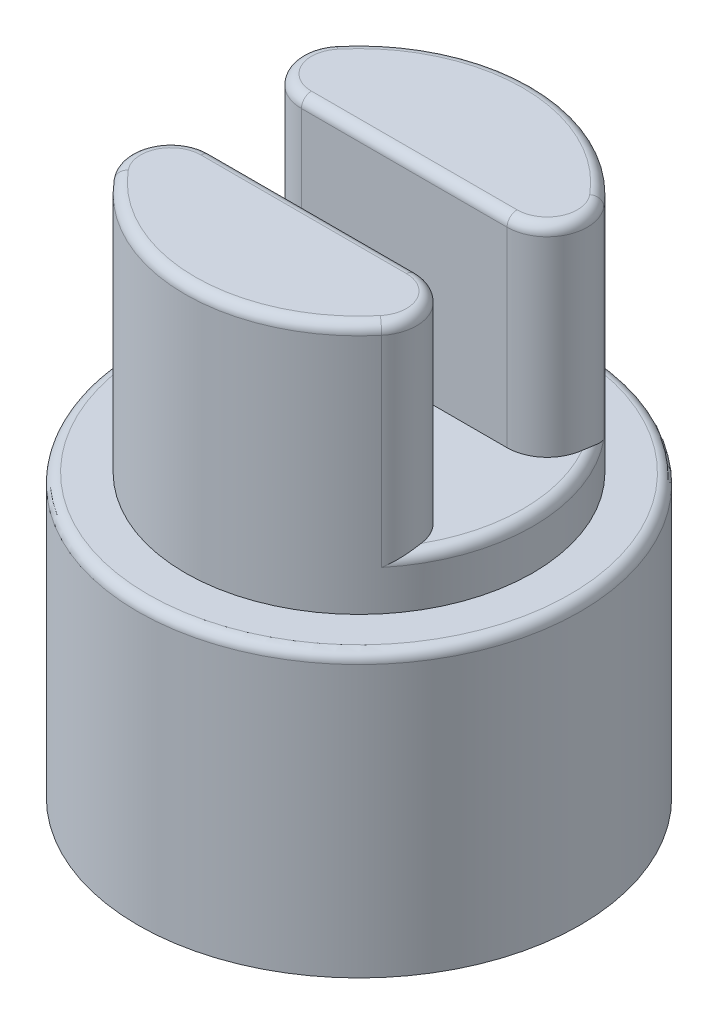
ISO-10303-21;
HEADER;
FILE_DESCRIPTION(('STEP AP214'),'2;1');
FILE_NAME('part.step','',(''),(''),'','','');
FILE_SCHEMA(('AUTOMOTIVE_DESIGN { 1 0 10303 214 1 1 1 1 }'));
ENDSEC;
DATA;
#1=APPLICATION_CONTEXT('core data for automotive mechanical design processes');
#2=APPLICATION_PROTOCOL_DEFINITION('international standard','automotive_design',2000,#1);
#3=PRODUCT_CONTEXT('',#1,'mechanical');
#4=PRODUCT('Part','Part','',(#3));
#5=PRODUCT_RELATED_PRODUCT_CATEGORY('part','',(#4));
#6=PRODUCT_DEFINITION_FORMATION('','',#4);
#7=PRODUCT_DEFINITION_CONTEXT('part definition',#1,'design');
#8=PRODUCT_DEFINITION('design','',#6,#7);
#9=PRODUCT_DEFINITION_SHAPE('','',#8);
#10=(LENGTH_UNIT() NAMED_UNIT(*) SI_UNIT(.MILLI.,.METRE.));
#11=(NAMED_UNIT(*) PLANE_ANGLE_UNIT() SI_UNIT($,.RADIAN.));
#12=(NAMED_UNIT(*) SI_UNIT($,.STERADIAN.) SOLID_ANGLE_UNIT());
#13=UNCERTAINTY_MEASURE_WITH_UNIT(LENGTH_MEASURE(1.E-05),#10,'distance_accuracy_value','');
#14=(GEOMETRIC_REPRESENTATION_CONTEXT(3) GLOBAL_UNCERTAINTY_ASSIGNED_CONTEXT((#13)) GLOBAL_UNIT_ASSIGNED_CONTEXT((#10,
#11,#12)) REPRESENTATION_CONTEXT('',''));
#15=CARTESIAN_POINT('',(0.,0.,0.));
#16=DIRECTION('',(0.,0.,1.));
#17=DIRECTION('',(1.,0.,0.));
#18=AXIS2_PLACEMENT_3D('',#15,#16,#17);
#19=CARTESIAN_POINT('',(0.,20.955,0.));
#20=DIRECTION('',(0.,1.,0.));
#21=DIRECTION('',(0.,0.,1.));
#22=AXIS2_PLACEMENT_3D('',#19,#20,#21);
#23=PLANE('',#22);
#24=CARTESIAN_POINT('',(6.49564962109256,20.955,5.3975));
#25=DIRECTION('',(0.,1.,0.));
#26=DIRECTION('',(0.,0.,1.));
#27=AXIS2_PLACEMENT_3D('',#24,#25,#26);
#28=CIRCLE('',#27,2.54);
#29=CARTESIAN_POINT('',(6.49564962109256,20.955,2.8575));
#30=VERTEX_POINT('',#29);
#31=CARTESIAN_POINT('',(9.01616246549347,20.955,5.08346974475373));
#32=VERTEX_POINT('',#31);
#33=EDGE_CURVE('E359',#30,#32,#28,.F.);
#34=ORIENTED_EDGE('',*,*,#33,.T.);
#35=CARTESIAN_POINT('',(0.,20.955,0.));
#36=DIRECTION('',(0.,1.,0.));
#37=DIRECTION('',(0.,0.,1.));
#38=AXIS2_PLACEMENT_3D('',#35,#36,#37);
#39=CIRCLE('',#38,10.3505);
#40=CARTESIAN_POINT('',(9.01616246549347,20.955,-5.08346974475373));
#41=VERTEX_POINT('',#40);
#42=EDGE_CURVE('E433',#32,#41,#39,.T.);
#43=ORIENTED_EDGE('',*,*,#42,.T.);
#44=CARTESIAN_POINT('',(6.49564962109257,20.955,-5.3975));
#45=DIRECTION('',(0.,1.,0.));
#46=DIRECTION('',(0.,0.,1.));
#47=AXIS2_PLACEMENT_3D('',#44,#45,#46);
#48=CIRCLE('',#47,2.54);
#49=CARTESIAN_POINT('',(6.49564962109256,20.955,-2.8575));
#50=VERTEX_POINT('',#49);
#51=EDGE_CURVE('E362',#41,#50,#48,.F.);
#52=ORIENTED_EDGE('',*,*,#51,.T.);
#53=DIRECTION('',(1.,0.,0.));
#54=VECTOR('',#53,1.);
#55=CARTESIAN_POINT('',(-10.6073514130531,20.955,-2.8575));
#56=LINE('',#55,#54);
#57=CARTESIAN_POINT('',(-6.49564962109257,20.955,-2.8575));
#58=VERTEX_POINT('',#57);
#59=EDGE_CURVE('E308',#58,#50,#56,.T.);
#60=ORIENTED_EDGE('',*,*,#59,.F.);
#61=CARTESIAN_POINT('',(-6.49564962109257,20.955,-5.3975));
#62=DIRECTION('',(0.,1.,0.));
#63=DIRECTION('',(0.,0.,1.));
#64=AXIS2_PLACEMENT_3D('',#61,#62,#63);
#65=CIRCLE('',#64,2.54);
#66=CARTESIAN_POINT('',(-9.01616246549347,20.955,-5.08346974475373));
#67=VERTEX_POINT('',#66);
#68=EDGE_CURVE('E355',#58,#67,#65,.F.);
#69=ORIENTED_EDGE('',*,*,#68,.T.);
#70=CARTESIAN_POINT('',(0.,20.955,0.));
#71=DIRECTION('',(0.,1.,0.));
#72=DIRECTION('',(0.,0.,1.));
#73=AXIS2_PLACEMENT_3D('',#70,#71,#72);
#74=CIRCLE('',#73,10.3505);
#75=CARTESIAN_POINT('',(-9.01616246549347,20.955,5.08346974475373));
#76=VERTEX_POINT('',#75);
#77=EDGE_CURVE('E429',#67,#76,#74,.T.);
#78=ORIENTED_EDGE('',*,*,#77,.T.);
#79=CARTESIAN_POINT('',(-6.49564962109256,20.955,5.3975));
#80=DIRECTION('',(0.,1.,0.));
#81=DIRECTION('',(0.,0.,1.));
#82=AXIS2_PLACEMENT_3D('',#79,#80,#81);
#83=CIRCLE('',#82,2.54);
#84=CARTESIAN_POINT('',(-6.49564962109257,20.955,2.8575));
#85=VERTEX_POINT('',#84);
#86=EDGE_CURVE('E352',#76,#85,#83,.F.);
#87=ORIENTED_EDGE('',*,*,#86,.T.);
#88=DIRECTION('',(-1.,0.,0.));
#89=VECTOR('',#88,1.);
#90=CARTESIAN_POINT('',(-10.6073514130531,20.955,2.8575));
#91=LINE('',#90,#89);
#92=EDGE_CURVE('E312',#30,#85,#91,.T.);
#93=ORIENTED_EDGE('',*,*,#92,.F.);
#94=EDGE_LOOP('',(#34,#43,#52,#60,#69,#78,#87,#93));
#95=FACE_BOUND('',#94,.T.);
#96=ADVANCED_FACE('F43',(#95),#23,.T.);
#97=CARTESIAN_POINT('',(0.,17.78,0.));
#98=DIRECTION('',(0.,-1.,0.));
#99=DIRECTION('',(0.,0.,-1.));
#100=AXIS2_PLACEMENT_3D('',#97,#98,#99);
#101=CYLINDRICAL_SURFACE('',#100,13.97);
#102=CARTESIAN_POINT('',(0.,17.145,0.));
#103=DIRECTION('',(0.,1.,0.));
#104=DIRECTION('',(0.,0.,1.));
#105=AXIS2_PLACEMENT_3D('',#102,#103,#104);
#106=CIRCLE('',#105,13.97);
#107=CARTESIAN_POINT('',(0.,17.145,13.97));
#108=VERTEX_POINT('',#107);
#109=EDGE_CURVE('E425',#108,#108,#106,.F.);
#110=ORIENTED_EDGE('',*,*,#109,.T.);
#111=EDGE_LOOP('',(#110));
#112=FACE_BOUND('',#111,.T.);
#113=CARTESIAN_POINT('',(0.,0.,0.));
#114=DIRECTION('',(0.,1.,0.));
#115=DIRECTION('',(0.,0.,1.));
#116=AXIS2_PLACEMENT_3D('',#113,#114,#115);
#117=CIRCLE('',#116,13.97);
#118=CARTESIAN_POINT('',(0.,0.,13.97));
#119=VERTEX_POINT('',#118);
#120=EDGE_CURVE('E317',#119,#119,#117,.T.);
#121=ORIENTED_EDGE('',*,*,#120,.T.);
#122=EDGE_LOOP('',(#121));
#123=FACE_BOUND('',#122,.T.);
#124=ADVANCED_FACE('F507',(#112,#123),#101,.T.);
#125=CARTESIAN_POINT('',(0.,17.78,0.));
#126=DIRECTION('',(0.,1.,0.));
#127=DIRECTION('',(0.,0.,1.));
#128=AXIS2_PLACEMENT_3D('',#125,#126,#127);
#129=PLANE('',#128);
#130=CARTESIAN_POINT('',(0.,17.78,0.));
#131=DIRECTION('',(0.,1.,0.));
#132=DIRECTION('',(0.,0.,1.));
#133=AXIS2_PLACEMENT_3D('',#130,#131,#132);
#134=CIRCLE('',#133,13.335);
#135=CARTESIAN_POINT('',(0.,17.78,13.335));
#136=VERTEX_POINT('',#135);
#137=EDGE_CURVE('E421',#136,#136,#134,.T.);
#138=ORIENTED_EDGE('',*,*,#137,.T.);
#139=EDGE_LOOP('',(#138));
#140=FACE_BOUND('',#139,.T.);
#141=CARTESIAN_POINT('',(0.,17.78,0.));
#142=DIRECTION('',(0.,1.,0.));
#143=DIRECTION('',(0.,0.,1.));
#144=AXIS2_PLACEMENT_3D('',#141,#142,#143);
#145=CIRCLE('',#144,10.9855);
#146=CARTESIAN_POINT('',(0.,17.78,10.9855));
#147=VERTEX_POINT('',#146);
#148=EDGE_CURVE('E318',#147,#147,#145,.T.);
#149=ORIENTED_EDGE('',*,*,#148,.F.);
#150=EDGE_LOOP('',(#149));
#151=FACE_BOUND('',#150,.T.);
#152=ADVANCED_FACE('F513',(#140,#151),#129,.T.);
#153=CARTESIAN_POINT('',(0.,0.,0.));
#154=DIRECTION('',(0.,1.,0.));
#155=DIRECTION('',(0.,0.,1.));
#156=AXIS2_PLACEMENT_3D('',#153,#154,#155);
#157=PLANE('',#156);
#158=CARTESIAN_POINT('',(0.,0.,0.));
#159=DIRECTION('',(0.,1.,0.));
#160=DIRECTION('',(0.,0.,1.));
#161=AXIS2_PLACEMENT_3D('',#158,#159,#160);
#162=CIRCLE('',#161,12.7);
#163=CARTESIAN_POINT('',(0.,0.,12.7));
#164=VERTEX_POINT('',#163);
#165=EDGE_CURVE('E256',#164,#164,#162,.T.);
#166=ORIENTED_EDGE('',*,*,#165,.T.);
#167=EDGE_LOOP('',(#166));
#168=FACE_BOUND('',#167,.T.);
#169=ORIENTED_EDGE('',*,*,#120,.F.);
#170=EDGE_LOOP('',(#169));
#171=FACE_BOUND('',#170,.T.);
#172=ADVANCED_FACE('F523',(#168,#171),#157,.F.);
#173=CARTESIAN_POINT('',(0.,20.955,0.));
#174=DIRECTION('',(0.,-1.,0.));
#175=DIRECTION('',(0.,0.,-1.));
#176=AXIS2_PLACEMENT_3D('',#173,#174,#175);
#177=CYLINDRICAL_SURFACE('',#176,10.9855);
#178=DIRECTION('',(0.,-1.,0.));
#179=VECTOR('',#178,1.);
#180=CARTESIAN_POINT('',(-8.44922845450387,20.955,-7.02080827067669));
#181=LINE('',#180,#179);
#182=CARTESIAN_POINT('',(-8.44922845450387,20.32,-7.02080827067669));
#183=VERTEX_POINT('',#182);
#184=CARTESIAN_POINT('',(-8.44922845450387,33.02,-7.02080827067669));
#185=VERTEX_POINT('',#184);
#186=EDGE_CURVE('E332',#183,#185,#181,.F.);
#187=ORIENTED_EDGE('',*,*,#186,.T.);
#188=CARTESIAN_POINT('',(0.,33.02,0.));
#189=DIRECTION('',(0.,-1.,0.));
#190=DIRECTION('',(0.,0.,-1.));
#191=AXIS2_PLACEMENT_3D('',#188,#189,#190);
#192=CIRCLE('',#191,10.9855);
#193=CARTESIAN_POINT('',(8.44922845450387,33.02,-7.02080827067669));
#194=VERTEX_POINT('',#193);
#195=EDGE_CURVE('E393',#185,#194,#192,.T.);
#196=ORIENTED_EDGE('',*,*,#195,.T.);
#197=DIRECTION('',(0.,-1.,0.));
#198=VECTOR('',#197,1.);
#199=CARTESIAN_POINT('',(8.44922845450387,20.955,-7.02080827067669));
#200=LINE('',#199,#198);
#201=CARTESIAN_POINT('',(8.44922845450387,20.32,-7.02080827067669));
#202=VERTEX_POINT('',#201);
#203=EDGE_CURVE('E322',#194,#202,#200,.T.);
#204=ORIENTED_EDGE('',*,*,#203,.T.);
#205=CARTESIAN_POINT('',(0.,20.32,0.));
#206=DIRECTION('',(0.,1.,0.));
#207=DIRECTION('',(0.,0.,1.));
#208=AXIS2_PLACEMENT_3D('',#205,#206,#207);
#209=CIRCLE('',#208,10.9855);
#210=CARTESIAN_POINT('',(8.44922845450386,20.32,7.02080827067669));
#211=VERTEX_POINT('',#210);
#212=EDGE_CURVE('E389',#202,#211,#209,.F.);
#213=ORIENTED_EDGE('',*,*,#212,.T.);
#214=DIRECTION('',(0.,-1.,0.));
#215=VECTOR('',#214,1.);
#216=CARTESIAN_POINT('',(8.44922845450386,20.955,7.02080827067669));
#217=LINE('',#216,#215);
#218=CARTESIAN_POINT('',(8.44922845450386,33.02,7.02080827067669));
#219=VERTEX_POINT('',#218);
#220=EDGE_CURVE('E328',#211,#219,#217,.F.);
#221=ORIENTED_EDGE('',*,*,#220,.T.);
#222=CARTESIAN_POINT('',(0.,33.02,0.));
#223=DIRECTION('',(0.,1.,0.));
#224=DIRECTION('',(0.,0.,1.));
#225=AXIS2_PLACEMENT_3D('',#222,#223,#224);
#226=CIRCLE('',#225,10.9855);
#227=CARTESIAN_POINT('',(-8.44922845450386,33.02,7.02080827067669));
#228=VERTEX_POINT('',#227);
#229=EDGE_CURVE('E382',#219,#228,#226,.F.);
#230=ORIENTED_EDGE('',*,*,#229,.T.);
#231=DIRECTION('',(0.,-1.,0.));
#232=VECTOR('',#231,1.);
#233=CARTESIAN_POINT('',(-8.44922845450386,20.955,7.02080827067669));
#234=LINE('',#233,#232);
#235=CARTESIAN_POINT('',(-8.44922845450386,20.32,7.02080827067669));
#236=VERTEX_POINT('',#235);
#237=EDGE_CURVE('E336',#228,#236,#234,.T.);
#238=ORIENTED_EDGE('',*,*,#237,.T.);
#239=CARTESIAN_POINT('',(0.,20.32,0.));
#240=DIRECTION('',(0.,1.,0.));
#241=DIRECTION('',(0.,0.,1.));
#242=AXIS2_PLACEMENT_3D('',#239,#240,#241);
#243=CIRCLE('',#242,10.9855);
#244=EDGE_CURVE('E385',#236,#183,#243,.F.);
#245=ORIENTED_EDGE('',*,*,#244,.T.);
#246=EDGE_LOOP('',(#187,#196,#204,#213,#221,#230,#238,#245));
#247=FACE_BOUND('',#246,.T.);
#248=ORIENTED_EDGE('',*,*,#148,.T.);
#249=EDGE_LOOP('',(#248));
#250=FACE_BOUND('',#249,.T.);
#251=ADVANCED_FACE('F520',(#247,#250),#177,.T.);
#252=CARTESIAN_POINT('',(-10.6073514130531,33.655,2.8575));
#253=DIRECTION('',(0.,0.,1.));
#254=DIRECTION('',(1.,0.,0.));
#255=AXIS2_PLACEMENT_3D('',#252,#253,#254);
#256=PLANE('',#255);
#257=DIRECTION('',(0.,-1.,0.));
#258=VECTOR('',#257,1.);
#259=CARTESIAN_POINT('',(-6.49564962109256,33.655,2.8575));
#260=LINE('',#259,#258);
#261=CARTESIAN_POINT('',(-6.49564962109256,33.02,2.8575));
#262=VERTEX_POINT('',#261);
#263=EDGE_CURVE('E342',#85,#262,#260,.F.);
#264=ORIENTED_EDGE('',*,*,#263,.T.);
#265=DIRECTION('',(-1.,0.,0.));
#266=VECTOR('',#265,1.);
#267=CARTESIAN_POINT('',(6.49564962109256,33.02,2.8575));
#268=LINE('',#267,#266);
#269=CARTESIAN_POINT('',(6.49564962109256,33.02,2.8575));
#270=VERTEX_POINT('',#269);
#271=EDGE_CURVE('E70',#262,#270,#268,.F.);
#272=ORIENTED_EDGE('',*,*,#271,.T.);
#273=DIRECTION('',(0.,-1.,0.));
#274=VECTOR('',#273,1.);
#275=CARTESIAN_POINT('',(6.49564962109256,33.655,2.8575));
#276=LINE('',#275,#274);
#277=EDGE_CURVE('E339',#270,#30,#276,.T.);
#278=ORIENTED_EDGE('',*,*,#277,.T.);
#279=ORIENTED_EDGE('',*,*,#92,.T.);
#280=EDGE_LOOP('',(#264,#272,#278,#279));
#281=FACE_BOUND('',#280,.T.);
#282=ADVANCED_FACE('F518',(#281),#256,.F.);
#283=CARTESIAN_POINT('',(0.,33.655,0.));
#284=DIRECTION('',(0.,1.,0.));
#285=DIRECTION('',(0.,0.,1.));
#286=AXIS2_PLACEMENT_3D('',#283,#284,#285);
#287=PLANE('',#286);
#288=DIRECTION('',(-1.,0.,0.));
#289=VECTOR('',#288,1.);
#290=CARTESIAN_POINT('',(-6.49564962109257,33.655,3.4925));
#291=LINE('',#290,#289);
#292=CARTESIAN_POINT('',(6.49564962109256,33.655,3.4925));
#293=VERTEX_POINT('',#292);
#294=CARTESIAN_POINT('',(-6.49564962109256,33.655,3.4925));
#295=VERTEX_POINT('',#294);
#296=EDGE_CURVE('E405',#293,#295,#291,.T.);
#297=ORIENTED_EDGE('',*,*,#296,.T.);
#298=CARTESIAN_POINT('',(-6.49564962109256,33.655,5.3975));
#299=DIRECTION('',(0.,1.,0.));
#300=DIRECTION('',(0.,0.,1.));
#301=AXIS2_PLACEMENT_3D('',#298,#299,#300);
#302=CIRCLE('',#301,1.905);
#303=CARTESIAN_POINT('',(-7.96083374615104,33.655,6.61498120300752));
#304=VERTEX_POINT('',#303);
#305=EDGE_CURVE('E408',#295,#304,#302,.T.);
#306=ORIENTED_EDGE('',*,*,#305,.T.);
#307=CARTESIAN_POINT('',(0.,33.655,0.));
#308=DIRECTION('',(0.,1.,0.));
#309=DIRECTION('',(0.,0.,1.));
#310=AXIS2_PLACEMENT_3D('',#307,#308,#309);
#311=CIRCLE('',#310,10.3505);
#312=CARTESIAN_POINT('',(7.96083374615104,33.655,6.61498120300752));
#313=VERTEX_POINT('',#312);
#314=EDGE_CURVE('E399',#304,#313,#311,.T.);
#315=ORIENTED_EDGE('',*,*,#314,.T.);
#316=CARTESIAN_POINT('',(6.49564962109256,33.655,5.3975));
#317=DIRECTION('',(0.,1.,0.));
#318=DIRECTION('',(0.,0.,1.));
#319=AXIS2_PLACEMENT_3D('',#316,#317,#318);
#320=CIRCLE('',#319,1.905);
#321=EDGE_CURVE('E402',#313,#293,#320,.T.);
#322=ORIENTED_EDGE('',*,*,#321,.T.);
#323=EDGE_LOOP('',(#297,#306,#315,#322));
#324=FACE_BOUND('',#323,.T.);
#325=ADVANCED_FACE('F613',(#324),#287,.T.);
#326=CARTESIAN_POINT('',(-10.6073514130531,33.655,-2.8575));
#327=DIRECTION('',(0.,0.,-1.));
#328=DIRECTION('',(-1.,0.,0.));
#329=AXIS2_PLACEMENT_3D('',#326,#327,#328);
#330=PLANE('',#329);
#331=DIRECTION('',(0.,-1.,0.));
#332=VECTOR('',#331,1.);
#333=CARTESIAN_POINT('',(6.49564962109257,33.655,-2.8575));
#334=LINE('',#333,#332);
#335=CARTESIAN_POINT('',(6.49564962109257,33.02,-2.8575));
#336=VERTEX_POINT('',#335);
#337=EDGE_CURVE('E345',#50,#336,#334,.F.);
#338=ORIENTED_EDGE('',*,*,#337,.T.);
#339=DIRECTION('',(1.,0.,0.));
#340=VECTOR('',#339,1.);
#341=CARTESIAN_POINT('',(-10.6073514130531,33.02,-2.8575));
#342=LINE('',#341,#340);
#343=CARTESIAN_POINT('',(-6.49564962109257,33.02,-2.8575));
#344=VERTEX_POINT('',#343);
#345=EDGE_CURVE('E437',#336,#344,#342,.F.);
#346=ORIENTED_EDGE('',*,*,#345,.T.);
#347=DIRECTION('',(0.,-1.,0.));
#348=VECTOR('',#347,1.);
#349=CARTESIAN_POINT('',(-6.49564962109257,33.655,-2.8575));
#350=LINE('',#349,#348);
#351=EDGE_CURVE('E349',#344,#58,#350,.T.);
#352=ORIENTED_EDGE('',*,*,#351,.T.);
#353=ORIENTED_EDGE('',*,*,#59,.T.);
#354=EDGE_LOOP('',(#338,#346,#352,#353));
#355=FACE_BOUND('',#354,.T.);
#356=ADVANCED_FACE('F592',(#355),#330,.F.);
#357=CARTESIAN_POINT('',(0.,33.655,0.));
#358=DIRECTION('',(0.,-1.,0.));
#359=DIRECTION('',(0.,0.,-1.));
#360=AXIS2_PLACEMENT_3D('',#357,#358,#359);
#361=PLANE('',#360);
#362=CARTESIAN_POINT('',(0.,33.655,0.));
#363=DIRECTION('',(0.,-1.,0.));
#364=DIRECTION('',(0.,0.,-1.));
#365=AXIS2_PLACEMENT_3D('',#362,#363,#364);
#366=CIRCLE('',#365,10.3505);
#367=CARTESIAN_POINT('',(7.96083374615104,33.655,-6.61498120300752));
#368=VERTEX_POINT('',#367);
#369=CARTESIAN_POINT('',(-7.96083374615104,33.655,-6.61498120300752));
#370=VERTEX_POINT('',#369);
#371=EDGE_CURVE('E371',#368,#370,#366,.F.);
#372=ORIENTED_EDGE('',*,*,#371,.T.);
#373=CARTESIAN_POINT('',(-6.49564962109257,33.655,-5.3975));
#374=DIRECTION('',(0.,-1.,0.));
#375=DIRECTION('',(0.,0.,-1.));
#376=AXIS2_PLACEMENT_3D('',#373,#374,#375);
#377=CIRCLE('',#376,1.905);
#378=CARTESIAN_POINT('',(-6.49564962109257,33.655,-3.4925));
#379=VERTEX_POINT('',#378);
#380=EDGE_CURVE('E374',#370,#379,#377,.F.);
#381=ORIENTED_EDGE('',*,*,#380,.T.);
#382=DIRECTION('',(1.,0.,0.));
#383=VECTOR('',#382,1.);
#384=CARTESIAN_POINT('',(0.,33.655,-3.4925));
#385=LINE('',#384,#383);
#386=CARTESIAN_POINT('',(6.49564962109257,33.655,-3.4925));
#387=VERTEX_POINT('',#386);
#388=EDGE_CURVE('E365',#379,#387,#385,.T.);
#389=ORIENTED_EDGE('',*,*,#388,.T.);
#390=CARTESIAN_POINT('',(6.49564962109257,33.655,-5.3975));
#391=DIRECTION('',(0.,-1.,0.));
#392=DIRECTION('',(0.,0.,-1.));
#393=AXIS2_PLACEMENT_3D('',#390,#391,#392);
#394=CIRCLE('',#393,1.905);
#395=EDGE_CURVE('E368',#387,#368,#394,.F.);
#396=ORIENTED_EDGE('',*,*,#395,.T.);
#397=EDGE_LOOP('',(#372,#381,#389,#396));
#398=FACE_BOUND('',#397,.T.);
#399=ADVANCED_FACE('F535',(#398),#361,.F.);
#400=CARTESIAN_POINT('',(-6.49564962109256,20.955,5.3975));
#401=DIRECTION('',(0.,-1.,0.));
#402=DIRECTION('',(0.,0.,-1.));
#403=AXIS2_PLACEMENT_3D('',#400,#401,#402);
#404=CYLINDRICAL_SURFACE('',#403,2.54);
#405=ORIENTED_EDGE('',*,*,#237,.F.);
#406=CARTESIAN_POINT('',(-6.49564962109256,33.02,5.3975));
#407=DIRECTION('',(0.,1.,0.));
#408=DIRECTION('',(0.,0.,1.));
#409=AXIS2_PLACEMENT_3D('',#406,#407,#408);
#410=CIRCLE('',#409,2.54);
#411=EDGE_CURVE('E412',#228,#262,#410,.F.);
#412=ORIENTED_EDGE('',*,*,#411,.T.);
#413=ORIENTED_EDGE('',*,*,#263,.F.);
#414=ORIENTED_EDGE('',*,*,#86,.F.);
#415=CARTESIAN_POINT('',(-9.01616246549347,20.955,5.08346974475373));
#416=CARTESIAN_POINT('',(-9.0219481865761,20.9549815472587,5.12985411561563));
#417=CARTESIAN_POINT('',(-9.02643539373392,20.9531737831505,5.17635826215241));
#418=CARTESIAN_POINT('',(-9.03283457831511,20.9465031135339,5.26925267447678));
#419=CARTESIAN_POINT('',(-9.03475080844922,20.9416452728182,5.31564300131407));
#420=CARTESIAN_POINT('',(-9.03604452649734,20.9294349106086,5.40780630217329));
#421=CARTESIAN_POINT('',(-9.03543870635608,20.9220990856887,5.45358132999755));
#422=CARTESIAN_POINT('',(-9.03179333420189,20.9053122602238,5.54465801106835));
#423=CARTESIAN_POINT('',(-9.02875234831828,20.8958600158547,5.58995936948415));
#424=CARTESIAN_POINT('',(-9.01221570216551,20.8554188430998,5.76601096889285));
#425=CARTESIAN_POINT('',(-8.98984795443309,20.8178090501096,5.89451554627302));
#426=CARTESIAN_POINT('',(-8.92685911469528,20.7334385772713,6.14417192374147));
#427=CARTESIAN_POINT('',(-8.88615599221247,20.6866373124162,6.26528787220472));
#428=CARTESIAN_POINT('',(-8.78880893916351,20.5883754161008,6.49686190492321));
#429=CARTESIAN_POINT('',(-8.7323630979387,20.5369777572737,6.60743087236158));
#430=CARTESIAN_POINT('',(-8.60480325184468,20.4319091828923,6.81812786411293));
#431=CARTESIAN_POINT('',(-8.53373163103459,20.3782451843679,6.91828482640447));
#432=CARTESIAN_POINT('',(-8.45370865906112,20.3230771227777,7.01540516693211));
#433=CARTESIAN_POINT('',(-8.45147131439272,20.3215385325327,7.01810909160627));
#434=CARTESIAN_POINT('',(-8.44922845450386,20.32,7.02080827067669));
#435=B_SPLINE_CURVE_WITH_KNOTS('',3,(#415,#416,#417,#418,#419,#420,#421,#422,#423,#424,#425,
#426,#427,#428,#429,#430,#431,#432,#433,#434),.UNSPECIFIED.,.F.,.F.,(4,2,2,2,2,2,2,2,2,4),(0.,
0.140119316937183,0.280006572439298,0.418969474684862,0.558014261079332,0.962934469106001,
1.36968452040206,1.77153101236888,2.17222898984014,2.18372493988077),.UNSPECIFIED.);
#436=EDGE_CURVE('E54',#76,#236,#435,.T.);
#437=ORIENTED_EDGE('',*,*,#436,.T.);
#438=EDGE_LOOP('',(#405,#412,#413,#414,#437));
#439=FACE_BOUND('',#438,.T.);
#440=ADVANCED_FACE('F531',(#439),#404,.T.);
#441=CARTESIAN_POINT('',(-6.49564962109257,20.955,-5.3975));
#442=DIRECTION('',(0.,-1.,0.));
#443=DIRECTION('',(0.,0.,-1.));
#444=AXIS2_PLACEMENT_3D('',#441,#442,#443);
#445=CYLINDRICAL_SURFACE('',#444,2.54);
#446=ORIENTED_EDGE('',*,*,#351,.F.);
#447=CARTESIAN_POINT('',(-6.49564962109257,33.02,-5.3975));
#448=DIRECTION('',(0.,-1.,0.));
#449=DIRECTION('',(0.,0.,-1.));
#450=AXIS2_PLACEMENT_3D('',#447,#448,#449);
#451=CIRCLE('',#450,2.54);
#452=EDGE_CURVE('E378',#344,#185,#451,.T.);
#453=ORIENTED_EDGE('',*,*,#452,.T.);
#454=ORIENTED_EDGE('',*,*,#186,.F.);
#455=CARTESIAN_POINT('',(-9.01616246549347,20.955,-5.08346974475373));
#456=CARTESIAN_POINT('',(-9.0219481865761,20.9549815472587,-5.12985411561561));
#457=CARTESIAN_POINT('',(-9.02643539373392,20.9531737831505,-5.17635826215239));
#458=CARTESIAN_POINT('',(-9.03283457831511,20.9465031135339,-5.26925267447674));
#459=CARTESIAN_POINT('',(-9.03475080844922,20.9416452728182,-5.31564300131402));
#460=CARTESIAN_POINT('',(-9.03604452649734,20.9294349106086,-5.40780630217325));
#461=CARTESIAN_POINT('',(-9.03543870635608,20.9220990856887,-5.45358132999751));
#462=CARTESIAN_POINT('',(-9.0317933342019,20.9053122602238,-5.54465801106833));
#463=CARTESIAN_POINT('',(-9.02875234831828,20.8958600158547,-5.58995936948414));
#464=CARTESIAN_POINT('',(-9.0122157021655,20.8554188430998,-5.76601096889286));
#465=CARTESIAN_POINT('',(-8.98984795443308,20.8178090501096,-5.89451554627306));
#466=CARTESIAN_POINT('',(-8.92685911469528,20.7334385772713,-6.14417192374148));
#467=CARTESIAN_POINT('',(-8.8861559922125,20.6866373124161,-6.26528787220469));
#468=CARTESIAN_POINT('',(-8.78880893916347,20.5883754161009,-6.49686190492325));
#469=CARTESIAN_POINT('',(-8.73236309793856,20.5369777572742,-6.60743087236174));
#470=CARTESIAN_POINT('',(-8.60480325184482,20.4319091828918,-6.81812786411276));
#471=CARTESIAN_POINT('',(-8.5337316310351,20.3782451843661,-6.91828482640384));
#472=CARTESIAN_POINT('',(-8.45370865906115,20.3230771227776,-7.01540516693208));
#473=CARTESIAN_POINT('',(-8.45147131439274,20.3215385325327,-7.01810909160625));
#474=CARTESIAN_POINT('',(-8.44922845450387,20.32,-7.02080827067669));
#475=B_SPLINE_CURVE_WITH_KNOTS('',3,(#455,#456,#457,#458,#459,#460,#461,#462,#463,#464,#465,
#466,#467,#468,#469,#470,#471,#472,#473,#474),.UNSPECIFIED.,.F.,.F.,(4,2,2,2,2,2,2,2,2,4),(0.,
0.140119316937155,0.280006572439243,0.418969474684832,0.558014261079334,0.962934469106044,
1.36968452040207,1.77153101236888,2.17222898984014,2.18372493988076),.UNSPECIFIED.);
#476=EDGE_CURVE('E11',#183,#67,#475,.F.);
#477=ORIENTED_EDGE('',*,*,#476,.T.);
#478=ORIENTED_EDGE('',*,*,#68,.F.);
#479=EDGE_LOOP('',(#446,#453,#454,#477,#478));
#480=FACE_BOUND('',#479,.T.);
#481=ADVANCED_FACE('F534',(#480),#445,.T.);
#482=CARTESIAN_POINT('',(6.49564962109256,20.955,5.3975));
#483=DIRECTION('',(0.,-1.,0.));
#484=DIRECTION('',(0.,0.,-1.));
#485=AXIS2_PLACEMENT_3D('',#482,#483,#484);
#486=CYLINDRICAL_SURFACE('',#485,2.54);
#487=ORIENTED_EDGE('',*,*,#277,.F.);
#488=CARTESIAN_POINT('',(6.49564962109256,33.02,5.3975));
#489=DIRECTION('',(0.,1.,0.));
#490=DIRECTION('',(0.,0.,1.));
#491=AXIS2_PLACEMENT_3D('',#488,#489,#490);
#492=CIRCLE('',#491,2.54);
#493=EDGE_CURVE('E418',#270,#219,#492,.F.);
#494=ORIENTED_EDGE('',*,*,#493,.T.);
#495=ORIENTED_EDGE('',*,*,#220,.F.);
#496=CARTESIAN_POINT('',(9.01616246549347,20.955,5.08346974475373));
#497=CARTESIAN_POINT('',(9.0219481865761,20.9549815472587,5.12985411561563));
#498=CARTESIAN_POINT('',(9.02643539373392,20.9531737831505,5.17635826215241));
#499=CARTESIAN_POINT('',(9.03283457831511,20.9465031135339,5.26925267447678));
#500=CARTESIAN_POINT('',(9.03475080844922,20.9416452728182,5.31564300131407));
#501=CARTESIAN_POINT('',(9.03604452649734,20.9294349106086,5.40780630217329));
#502=CARTESIAN_POINT('',(9.03543870635608,20.9220990856887,5.45358132999755));
#503=CARTESIAN_POINT('',(9.03179333420189,20.9053122602238,5.54465801106835));
#504=CARTESIAN_POINT('',(9.02875234831828,20.8958600158547,5.58995936948415));
#505=CARTESIAN_POINT('',(9.01221570216551,20.8554188430998,5.76601096889285));
#506=CARTESIAN_POINT('',(8.98984795443309,20.8178090501096,5.89451554627302));
#507=CARTESIAN_POINT('',(8.92685911469528,20.7334385772713,6.14417192374147));
#508=CARTESIAN_POINT('',(8.88615599221247,20.6866373124162,6.26528787220472));
#509=CARTESIAN_POINT('',(8.78880893916351,20.5883754161008,6.49686190492321));
#510=CARTESIAN_POINT('',(8.7323630979387,20.5369777572737,6.60743087236158));
#511=CARTESIAN_POINT('',(8.60480325184468,20.4319091828923,6.81812786411293));
#512=CARTESIAN_POINT('',(8.53373163103459,20.3782451843679,6.91828482640447));
#513=CARTESIAN_POINT('',(8.45370865906112,20.3230771227777,7.01540516693211));
#514=CARTESIAN_POINT('',(8.45147131439272,20.3215385325327,7.01810909160627));
#515=CARTESIAN_POINT('',(8.44922845450386,20.32,7.02080827067669));
#516=B_SPLINE_CURVE_WITH_KNOTS('',3,(#496,#497,#498,#499,#500,#501,#502,#503,#504,#505,#506,
#507,#508,#509,#510,#511,#512,#513,#514,#515),.UNSPECIFIED.,.F.,.F.,(4,2,2,2,2,2,2,2,2,4),(0.,
0.140119316937183,0.280006572439298,0.418969474684862,0.558014261079332,0.962934469106001,
1.36968452040206,1.77153101236888,2.17222898984014,2.18372493988077),.UNSPECIFIED.);
#517=EDGE_CURVE('E62',#211,#32,#516,.F.);
#518=ORIENTED_EDGE('',*,*,#517,.T.);
#519=ORIENTED_EDGE('',*,*,#33,.F.);
#520=EDGE_LOOP('',(#487,#494,#495,#518,#519));
#521=FACE_BOUND('',#520,.T.);
#522=ADVANCED_FACE('F463',(#521),#486,.T.);
#523=CARTESIAN_POINT('',(6.49564962109257,20.955,-5.3975));
#524=DIRECTION('',(0.,-1.,0.));
#525=DIRECTION('',(0.,0.,-1.));
#526=AXIS2_PLACEMENT_3D('',#523,#524,#525);
#527=CYLINDRICAL_SURFACE('',#526,2.54);
#528=ORIENTED_EDGE('',*,*,#203,.F.);
#529=CARTESIAN_POINT('',(6.49564962109257,33.02,-5.3975));
#530=DIRECTION('',(0.,-1.,0.));
#531=DIRECTION('',(0.,0.,-1.));
#532=AXIS2_PLACEMENT_3D('',#529,#530,#531);
#533=CIRCLE('',#532,2.54);
#534=EDGE_CURVE('E396',#194,#336,#533,.T.);
#535=ORIENTED_EDGE('',*,*,#534,.T.);
#536=ORIENTED_EDGE('',*,*,#337,.F.);
#537=ORIENTED_EDGE('',*,*,#51,.F.);
#538=CARTESIAN_POINT('',(9.01616246549347,20.955,-5.08346974475373));
#539=CARTESIAN_POINT('',(9.0219481865761,20.9549815472587,-5.12985411561561));
#540=CARTESIAN_POINT('',(9.02643539373392,20.9531737831505,-5.17635826215239));
#541=CARTESIAN_POINT('',(9.03283457831511,20.9465031135339,-5.26925267447674));
#542=CARTESIAN_POINT('',(9.03475080844922,20.9416452728182,-5.31564300131402));
#543=CARTESIAN_POINT('',(9.03604452649734,20.9294349106086,-5.40780630217325));
#544=CARTESIAN_POINT('',(9.03543870635608,20.9220990856887,-5.45358132999751));
#545=CARTESIAN_POINT('',(9.0317933342019,20.9053122602238,-5.54465801106833));
#546=CARTESIAN_POINT('',(9.02875234831828,20.8958600158547,-5.58995936948414));
#547=CARTESIAN_POINT('',(9.0122157021655,20.8554188430998,-5.76601096889286));
#548=CARTESIAN_POINT('',(8.98984795443308,20.8178090501096,-5.89451554627306));
#549=CARTESIAN_POINT('',(8.92685911469528,20.7334385772713,-6.14417192374148));
#550=CARTESIAN_POINT('',(8.8861559922125,20.6866373124161,-6.26528787220469));
#551=CARTESIAN_POINT('',(8.78880893916347,20.5883754161009,-6.49686190492325));
#552=CARTESIAN_POINT('',(8.73236309793856,20.5369777572742,-6.60743087236174));
#553=CARTESIAN_POINT('',(8.60480325184482,20.4319091828918,-6.81812786411276));
#554=CARTESIAN_POINT('',(8.5337316310351,20.3782451843661,-6.91828482640384));
#555=CARTESIAN_POINT('',(8.45370865906115,20.3230771227776,-7.01540516693208));
#556=CARTESIAN_POINT('',(8.45147131439274,20.3215385325327,-7.01810909160625));
#557=CARTESIAN_POINT('',(8.44922845450387,20.32,-7.02080827067669));
#558=B_SPLINE_CURVE_WITH_KNOTS('',3,(#538,#539,#540,#541,#542,#543,#544,#545,#546,#547,#548,
#549,#550,#551,#552,#553,#554,#555,#556,#557),.UNSPECIFIED.,.F.,.F.,(4,2,2,2,2,2,2,2,2,4),(0.,
0.140119316937155,0.280006572439243,0.418969474684832,0.558014261079334,0.962934469106044,
1.36968452040207,1.77153101236888,2.17222898984014,2.18372493988076),.UNSPECIFIED.);
#559=EDGE_CURVE('E440',#41,#202,#558,.T.);
#560=ORIENTED_EDGE('',*,*,#559,.T.);
#561=EDGE_LOOP('',(#528,#535,#536,#537,#560));
#562=FACE_BOUND('',#561,.T.);
#563=ADVANCED_FACE('F458',(#562),#527,.T.);
#564=CARTESIAN_POINT('',(6.49564962109257,33.02,-5.3975));
#565=DIRECTION('',(0.,-1.,0.));
#566=DIRECTION('',(0.,0.,-1.));
#567=AXIS2_PLACEMENT_3D('',#564,#565,#566);
#568=TOROIDAL_SURFACE('',#567,1.905,0.635);
#569=CARTESIAN_POINT('',(6.49564962109257,33.02,-3.4925));
#570=DIRECTION('',(-1.,0.,0.));
#571=DIRECTION('',(0.,0.,1.));
#572=AXIS2_PLACEMENT_3D('',#569,#570,#571);
#573=CIRCLE('',#572,0.635);
#574=EDGE_CURVE('E555',#336,#387,#573,.T.);
#575=ORIENTED_EDGE('',*,*,#574,.F.);
#576=ORIENTED_EDGE('',*,*,#534,.F.);
#577=CARTESIAN_POINT('',(7.96083374615104,33.02,-6.61498120300752));
#578=DIRECTION('',(-0.639097744360902,0.,-0.769125524965078));
#579=DIRECTION('',(-0.769125524965078,0.,0.639097744360902));
#580=AXIS2_PLACEMENT_3D('',#577,#578,#579);
#581=CIRCLE('',#580,0.635);
#582=EDGE_CURVE('E313',#368,#194,#581,.T.);
#583=ORIENTED_EDGE('',*,*,#582,.F.);
#584=ORIENTED_EDGE('',*,*,#395,.F.);
#585=EDGE_LOOP('',(#575,#576,#583,#584));
#586=FACE_BOUND('',#585,.T.);
#587=ADVANCED_FACE('F462',(#586),#568,.T.);
#588=CARTESIAN_POINT('',(0.,33.02,0.));
#589=DIRECTION('',(0.,-1.,0.));
#590=DIRECTION('',(0.,0.,-1.));
#591=AXIS2_PLACEMENT_3D('',#588,#589,#590);
#592=TOROIDAL_SURFACE('',#591,10.3505,0.635);
#593=ORIENTED_EDGE('',*,*,#582,.T.);
#594=ORIENTED_EDGE('',*,*,#195,.F.);
#595=CARTESIAN_POINT('',(-7.96083374615104,33.02,-6.61498120300752));
#596=DIRECTION('',(-0.639097744360902,0.,0.769125524965078));
#597=DIRECTION('',(0.769125524965078,0.,0.639097744360902));
#598=AXIS2_PLACEMENT_3D('',#595,#596,#597);
#599=CIRCLE('',#598,0.635);
#600=EDGE_CURVE('E552',#370,#185,#599,.T.);
#601=ORIENTED_EDGE('',*,*,#600,.F.);
#602=ORIENTED_EDGE('',*,*,#371,.F.);
#603=EDGE_LOOP('',(#593,#594,#601,#602));
#604=FACE_BOUND('',#603,.T.);
#605=ADVANCED_FACE('F475',(#604),#592,.T.);
#606=CARTESIAN_POINT('',(0.,33.02,-3.4925));
#607=DIRECTION('',(1.,0.,0.));
#608=DIRECTION('',(0.,0.,-1.));
#609=AXIS2_PLACEMENT_3D('',#606,#607,#608);
#610=CYLINDRICAL_SURFACE('',#609,0.635);
#611=ORIENTED_EDGE('',*,*,#574,.T.);
#612=ORIENTED_EDGE('',*,*,#388,.F.);
#613=CARTESIAN_POINT('',(-6.49564962109257,33.02,-3.4925));
#614=DIRECTION('',(-1.,0.,0.));
#615=DIRECTION('',(0.,0.,1.));
#616=AXIS2_PLACEMENT_3D('',#613,#614,#615);
#617=CIRCLE('',#616,0.635);
#618=EDGE_CURVE('E549',#344,#379,#617,.T.);
#619=ORIENTED_EDGE('',*,*,#618,.F.);
#620=ORIENTED_EDGE('',*,*,#345,.F.);
#621=EDGE_LOOP('',(#611,#612,#619,#620));
#622=FACE_BOUND('',#621,.T.);
#623=ADVANCED_FACE('F471',(#622),#610,.T.);
#624=CARTESIAN_POINT('',(-6.49564962109257,33.02,-5.3975));
#625=DIRECTION('',(0.,-1.,0.));
#626=DIRECTION('',(0.,0.,-1.));
#627=AXIS2_PLACEMENT_3D('',#624,#625,#626);
#628=TOROIDAL_SURFACE('',#627,1.905,0.635);
#629=ORIENTED_EDGE('',*,*,#600,.T.);
#630=ORIENTED_EDGE('',*,*,#452,.F.);
#631=ORIENTED_EDGE('',*,*,#618,.T.);
#632=ORIENTED_EDGE('',*,*,#380,.F.);
#633=EDGE_LOOP('',(#629,#630,#631,#632));
#634=FACE_BOUND('',#633,.T.);
#635=ADVANCED_FACE('F467',(#634),#628,.T.);
#636=CARTESIAN_POINT('',(6.49564962109256,33.02,5.3975));
#637=DIRECTION('',(0.,1.,0.));
#638=DIRECTION('',(0.,0.,1.));
#639=AXIS2_PLACEMENT_3D('',#636,#637,#638);
#640=TOROIDAL_SURFACE('',#639,1.905,0.635);
#641=CARTESIAN_POINT('',(7.96083374615104,33.02,6.61498120300752));
#642=DIRECTION('',(-0.639097744360902,0.,0.769125524965078));
#643=DIRECTION('',(0.769125524965078,0.,0.639097744360902));
#644=AXIS2_PLACEMENT_3D('',#641,#642,#643);
#645=CIRCLE('',#644,0.635);
#646=EDGE_CURVE('E566',#219,#313,#645,.T.);
#647=ORIENTED_EDGE('',*,*,#646,.F.);
#648=ORIENTED_EDGE('',*,*,#493,.F.);
#649=CARTESIAN_POINT('',(6.49564962109256,33.02,3.4925));
#650=DIRECTION('',(-1.,0.,0.));
#651=DIRECTION('',(0.,0.,1.));
#652=AXIS2_PLACEMENT_3D('',#649,#650,#651);
#653=CIRCLE('',#652,0.635);
#654=EDGE_CURVE('E48',#293,#270,#653,.T.);
#655=ORIENTED_EDGE('',*,*,#654,.F.);
#656=ORIENTED_EDGE('',*,*,#321,.F.);
#657=EDGE_LOOP('',(#647,#648,#655,#656));
#658=FACE_BOUND('',#657,.T.);
#659=ADVANCED_FACE('F470',(#658),#640,.T.);
#660=CARTESIAN_POINT('',(0.,33.02,3.4925));
#661=DIRECTION('',(1.,0.,0.));
#662=DIRECTION('',(0.,0.,-1.));
#663=AXIS2_PLACEMENT_3D('',#660,#661,#662);
#664=CYLINDRICAL_SURFACE('',#663,0.635);
#665=ORIENTED_EDGE('',*,*,#654,.T.);
#666=ORIENTED_EDGE('',*,*,#271,.F.);
#667=CARTESIAN_POINT('',(-6.49564962109256,33.02,3.4925));
#668=DIRECTION('',(-1.,0.,0.));
#669=DIRECTION('',(0.,0.,1.));
#670=AXIS2_PLACEMENT_3D('',#667,#668,#669);
#671=CIRCLE('',#670,0.635);
#672=EDGE_CURVE('E564',#295,#262,#671,.T.);
#673=ORIENTED_EDGE('',*,*,#672,.F.);
#674=ORIENTED_EDGE('',*,*,#296,.F.);
#675=EDGE_LOOP('',(#665,#666,#673,#674));
#676=FACE_BOUND('',#675,.T.);
#677=ADVANCED_FACE('F491',(#676),#664,.T.);
#678=CARTESIAN_POINT('',(0.,33.02,0.));
#679=DIRECTION('',(0.,1.,0.));
#680=DIRECTION('',(0.,0.,1.));
#681=AXIS2_PLACEMENT_3D('',#678,#679,#680);
#682=TOROIDAL_SURFACE('',#681,10.3505,0.635);
#683=ORIENTED_EDGE('',*,*,#646,.T.);
#684=ORIENTED_EDGE('',*,*,#314,.F.);
#685=CARTESIAN_POINT('',(-7.96083374615104,33.02,6.61498120300752));
#686=DIRECTION('',(-0.639097744360903,0.,-0.769125524965077));
#687=DIRECTION('',(-0.769125524965077,0.,0.639097744360903));
#688=AXIS2_PLACEMENT_3D('',#685,#686,#687);
#689=CIRCLE('',#688,0.635);
#690=EDGE_CURVE('E275',#228,#304,#689,.T.);
#691=ORIENTED_EDGE('',*,*,#690,.F.);
#692=ORIENTED_EDGE('',*,*,#229,.F.);
#693=EDGE_LOOP('',(#683,#684,#691,#692));
#694=FACE_BOUND('',#693,.T.);
#695=ADVANCED_FACE('F487',(#694),#682,.T.);
#696=CARTESIAN_POINT('',(-6.49564962109256,33.02,5.3975));
#697=DIRECTION('',(0.,1.,0.));
#698=DIRECTION('',(0.,0.,1.));
#699=AXIS2_PLACEMENT_3D('',#696,#697,#698);
#700=TOROIDAL_SURFACE('',#699,1.905,0.635);
#701=ORIENTED_EDGE('',*,*,#672,.T.);
#702=ORIENTED_EDGE('',*,*,#411,.F.);
#703=ORIENTED_EDGE('',*,*,#690,.T.);
#704=ORIENTED_EDGE('',*,*,#305,.F.);
#705=EDGE_LOOP('',(#701,#702,#703,#704));
#706=FACE_BOUND('',#705,.T.);
#707=ADVANCED_FACE('F483',(#706),#700,.T.);
#708=CARTESIAN_POINT('',(0.,17.145,0.));
#709=DIRECTION('',(0.,1.,0.));
#710=DIRECTION('',(0.,0.,1.));
#711=AXIS2_PLACEMENT_3D('',#708,#709,#710);
#712=TOROIDAL_SURFACE('',#711,13.335,0.635);
#713=ORIENTED_EDGE('',*,*,#109,.F.);
#714=EDGE_LOOP('',(#713));
#715=FACE_BOUND('',#714,.T.);
#716=ORIENTED_EDGE('',*,*,#137,.F.);
#717=EDGE_LOOP('',(#716));
#718=FACE_BOUND('',#717,.T.);
#719=ADVANCED_FACE('F486',(#715,#718),#712,.T.);
#720=CARTESIAN_POINT('',(0.,20.32,0.));
#721=DIRECTION('',(0.,1.,0.));
#722=DIRECTION('',(0.,0.,1.));
#723=AXIS2_PLACEMENT_3D('',#720,#721,#722);
#724=TOROIDAL_SURFACE('',#723,10.3505,0.635);
#725=ORIENTED_EDGE('',*,*,#517,.F.);
#726=ORIENTED_EDGE('',*,*,#212,.F.);
#727=ORIENTED_EDGE('',*,*,#559,.F.);
#728=ORIENTED_EDGE('',*,*,#42,.F.);
#729=EDGE_LOOP('',(#725,#726,#727,#728));
#730=FACE_BOUND('',#729,.T.);
#731=ADVANCED_FACE('F455',(#730),#724,.T.);
#732=CARTESIAN_POINT('',(0.,20.32,0.));
#733=DIRECTION('',(0.,1.,0.));
#734=DIRECTION('',(0.,0.,1.));
#735=AXIS2_PLACEMENT_3D('',#732,#733,#734);
#736=TOROIDAL_SURFACE('',#735,10.3505,0.635);
#737=ORIENTED_EDGE('',*,*,#476,.F.);
#738=ORIENTED_EDGE('',*,*,#244,.F.);
#739=ORIENTED_EDGE('',*,*,#436,.F.);
#740=ORIENTED_EDGE('',*,*,#77,.F.);
#741=EDGE_LOOP('',(#737,#738,#739,#740));
#742=FACE_BOUND('',#741,.T.);
#743=ADVANCED_FACE('F45',(#742),#736,.T.);
#744=CARTESIAN_POINT('',(0.,19.685,0.));
#745=DIRECTION('',(0.,1.,0.));
#746=DIRECTION('',(0.,0.,1.));
#747=AXIS2_PLACEMENT_3D('',#744,#745,#746);
#748=PLANE('',#747);
#749=CARTESIAN_POINT('',(6.49564962109256,19.685,5.3975));
#750=DIRECTION('',(0.,1.,0.));
#751=DIRECTION('',(0.,0.,1.));
#752=AXIS2_PLACEMENT_3D('',#749,#750,#751);
#753=CIRCLE('',#752,1.27);
#754=CARTESIAN_POINT('',(6.49564962109256,19.685,4.1275));
#755=VERTEX_POINT('',#754);
#756=CARTESIAN_POINT('',(7.47243903779821,19.685,6.20915413533835));
#757=VERTEX_POINT('',#756);
#758=EDGE_CURVE('E197',#755,#757,#753,.F.);
#759=ORIENTED_EDGE('',*,*,#758,.F.);
#760=DIRECTION('',(-1.,0.,0.));
#761=VECTOR('',#760,1.);
#762=CARTESIAN_POINT('',(-10.6073514130531,19.685,4.1275));
#763=LINE('',#762,#761);
#764=CARTESIAN_POINT('',(-6.49564962109256,19.685,4.1275));
#765=VERTEX_POINT('',#764);
#766=EDGE_CURVE('E247',#755,#765,#763,.T.);
#767=ORIENTED_EDGE('',*,*,#766,.T.);
#768=CARTESIAN_POINT('',(-6.49564962109256,19.685,5.3975));
#769=DIRECTION('',(0.,1.,0.));
#770=DIRECTION('',(0.,0.,1.));
#771=AXIS2_PLACEMENT_3D('',#768,#769,#770);
#772=CIRCLE('',#771,1.27);
#773=CARTESIAN_POINT('',(-7.47243903779821,19.685,6.20915413533835));
#774=VERTEX_POINT('',#773);
#775=EDGE_CURVE('E249',#774,#765,#772,.F.);
#776=ORIENTED_EDGE('',*,*,#775,.F.);
#777=CARTESIAN_POINT('',(0.,19.685,0.));
#778=DIRECTION('',(0.,1.,0.));
#779=DIRECTION('',(0.,0.,1.));
#780=AXIS2_PLACEMENT_3D('',#777,#778,#779);
#781=CIRCLE('',#780,9.7155);
#782=CARTESIAN_POINT('',(-7.47243903779822,19.685,-6.20915413533834));
#783=VERTEX_POINT('',#782);
#784=EDGE_CURVE('E230',#774,#783,#781,.F.);
#785=ORIENTED_EDGE('',*,*,#784,.T.);
#786=CARTESIAN_POINT('',(-6.49564962109257,19.685,-5.3975));
#787=DIRECTION('',(0.,1.,0.));
#788=DIRECTION('',(0.,0.,1.));
#789=AXIS2_PLACEMENT_3D('',#786,#787,#788);
#790=CIRCLE('',#789,1.27);
#791=CARTESIAN_POINT('',(-6.49564962109257,19.685,-4.1275));
#792=VERTEX_POINT('',#791);
#793=EDGE_CURVE('E209',#792,#783,#790,.F.);
#794=ORIENTED_EDGE('',*,*,#793,.F.);
#795=DIRECTION('',(1.,0.,0.));
#796=VECTOR('',#795,1.);
#797=CARTESIAN_POINT('',(-10.6073514130531,19.685,-4.1275));
#798=LINE('',#797,#796);
#799=CARTESIAN_POINT('',(6.49564962109257,19.685,-4.1275));
#800=VERTEX_POINT('',#799);
#801=EDGE_CURVE('E244',#792,#800,#798,.T.);
#802=ORIENTED_EDGE('',*,*,#801,.T.);
#803=CARTESIAN_POINT('',(6.49564962109257,19.685,-5.3975));
#804=DIRECTION('',(0.,1.,0.));
#805=DIRECTION('',(0.,0.,1.));
#806=AXIS2_PLACEMENT_3D('',#803,#804,#805);
#807=CIRCLE('',#806,1.27);
#808=CARTESIAN_POINT('',(7.47243903779821,19.685,-6.20915413533834));
#809=VERTEX_POINT('',#808);
#810=EDGE_CURVE('E208',#809,#800,#807,.F.);
#811=ORIENTED_EDGE('',*,*,#810,.F.);
#812=CARTESIAN_POINT('',(0.,19.685,0.));
#813=DIRECTION('',(0.,1.,0.));
#814=DIRECTION('',(0.,0.,1.));
#815=AXIS2_PLACEMENT_3D('',#812,#813,#814);
#816=CIRCLE('',#815,9.7155);
#817=EDGE_CURVE('E216',#809,#757,#816,.F.);
#818=ORIENTED_EDGE('',*,*,#817,.T.);
#819=EDGE_LOOP('',(#759,#767,#776,#785,#794,#802,#811,#818));
#820=FACE_BOUND('',#819,.T.);
#821=ADVANCED_FACE('F226',(#820),#748,.F.);
#822=CARTESIAN_POINT('',(0.,17.78,0.));
#823=DIRECTION('',(0.,-1.,0.));
#824=DIRECTION('',(0.,0.,-1.));
#825=AXIS2_PLACEMENT_3D('',#822,#823,#824);
#826=CYLINDRICAL_SURFACE('',#825,12.7);
#827=CARTESIAN_POINT('',(0.,16.51,0.));
#828=DIRECTION('',(0.,1.,0.));
#829=DIRECTION('',(0.,0.,1.));
#830=AXIS2_PLACEMENT_3D('',#827,#828,#829);
#831=CIRCLE('',#830,12.7);
#832=CARTESIAN_POINT('',(0.,16.51,12.7));
#833=VERTEX_POINT('',#832);
#834=EDGE_CURVE('E271',#833,#833,#831,.T.);
#835=ORIENTED_EDGE('',*,*,#834,.T.);
#836=EDGE_LOOP('',(#835));
#837=FACE_BOUND('',#836,.T.);
#838=ORIENTED_EDGE('',*,*,#165,.F.);
#839=EDGE_LOOP('',(#838));
#840=FACE_BOUND('',#839,.T.);
#841=ADVANCED_FACE('F661',(#837,#840),#826,.F.);
#842=CARTESIAN_POINT('',(0.,16.51,0.));
#843=DIRECTION('',(0.,1.,0.));
#844=DIRECTION('',(0.,0.,1.));
#845=AXIS2_PLACEMENT_3D('',#842,#843,#844);
#846=PLANE('',#845);
#847=ORIENTED_EDGE('',*,*,#834,.F.);
#848=EDGE_LOOP('',(#847));
#849=FACE_BOUND('',#848,.T.);
#850=CARTESIAN_POINT('',(0.,16.51,0.));
#851=DIRECTION('',(0.,1.,0.));
#852=DIRECTION('',(0.,0.,1.));
#853=AXIS2_PLACEMENT_3D('',#850,#851,#852);
#854=CIRCLE('',#853,9.7155);
#855=CARTESIAN_POINT('',(0.,16.51,9.7155));
#856=VERTEX_POINT('',#855);
#857=EDGE_CURVE('E261',#856,#856,#854,.T.);
#858=ORIENTED_EDGE('',*,*,#857,.T.);
#859=EDGE_LOOP('',(#858));
#860=FACE_BOUND('',#859,.T.);
#861=ADVANCED_FACE('F658',(#849,#860),#846,.F.);
#862=CARTESIAN_POINT('',(0.,20.955,0.));
#863=DIRECTION('',(0.,-1.,0.));
#864=DIRECTION('',(0.,0.,-1.));
#865=AXIS2_PLACEMENT_3D('',#862,#863,#864);
#866=CYLINDRICAL_SURFACE('',#865,9.7155);
#867=DIRECTION('',(0.,-1.,0.));
#868=VECTOR('',#867,1.);
#869=CARTESIAN_POINT('',(-7.47243903779822,20.955,-6.20915413533834));
#870=LINE('',#869,#868);
#871=CARTESIAN_POINT('',(-7.47243903779822,32.385,-6.20915413533834));
#872=VERTEX_POINT('',#871);
#873=EDGE_CURVE('E223',#783,#872,#870,.F.);
#874=ORIENTED_EDGE('',*,*,#873,.F.);
#875=ORIENTED_EDGE('',*,*,#784,.F.);
#876=DIRECTION('',(0.,-1.,0.));
#877=VECTOR('',#876,1.);
#878=CARTESIAN_POINT('',(-7.47243903779821,20.955,6.20915413533835));
#879=LINE('',#878,#877);
#880=CARTESIAN_POINT('',(-7.47243903779821,32.385,6.20915413533835));
#881=VERTEX_POINT('',#880);
#882=EDGE_CURVE('E258',#881,#774,#879,.T.);
#883=ORIENTED_EDGE('',*,*,#882,.F.);
#884=CARTESIAN_POINT('',(0.,32.385,0.));
#885=DIRECTION('',(0.,1.,0.));
#886=DIRECTION('',(0.,0.,1.));
#887=AXIS2_PLACEMENT_3D('',#884,#885,#886);
#888=CIRCLE('',#887,9.7155);
#889=CARTESIAN_POINT('',(7.47243903779821,32.385,6.20915413533835));
#890=VERTEX_POINT('',#889);
#891=EDGE_CURVE('E220',#881,#890,#888,.T.);
#892=ORIENTED_EDGE('',*,*,#891,.T.);
#893=DIRECTION('',(0.,-1.,0.));
#894=VECTOR('',#893,1.);
#895=CARTESIAN_POINT('',(7.47243903779821,20.955,6.20915413533835));
#896=LINE('',#895,#894);
#897=EDGE_CURVE('E201',#757,#890,#896,.F.);
#898=ORIENTED_EDGE('',*,*,#897,.F.);
#899=ORIENTED_EDGE('',*,*,#817,.F.);
#900=DIRECTION('',(0.,-1.,0.));
#901=VECTOR('',#900,1.);
#902=CARTESIAN_POINT('',(7.47243903779821,20.955,-6.20915413533834));
#903=LINE('',#902,#901);
#904=CARTESIAN_POINT('',(7.47243903779821,32.385,-6.20915413533834));
#905=VERTEX_POINT('',#904);
#906=EDGE_CURVE('E224',#905,#809,#903,.T.);
#907=ORIENTED_EDGE('',*,*,#906,.F.);
#908=CARTESIAN_POINT('',(0.,32.385,0.));
#909=DIRECTION('',(0.,-1.,0.));
#910=DIRECTION('',(0.,0.,-1.));
#911=AXIS2_PLACEMENT_3D('',#908,#909,#910);
#912=CIRCLE('',#911,9.7155);
#913=EDGE_CURVE('E229',#872,#905,#912,.T.);
#914=ORIENTED_EDGE('',*,*,#913,.F.);
#915=EDGE_LOOP('',(#874,#875,#883,#892,#898,#899,#907,#914));
#916=FACE_BOUND('',#915,.T.);
#917=ORIENTED_EDGE('',*,*,#857,.F.);
#918=EDGE_LOOP('',(#917));
#919=FACE_BOUND('',#918,.T.);
#920=ADVANCED_FACE('F214',(#916,#919),#866,.F.);
#921=CARTESIAN_POINT('',(-10.6073514130531,33.655,4.1275));
#922=DIRECTION('',(0.,0.,1.));
#923=DIRECTION('',(1.,0.,0.));
#924=AXIS2_PLACEMENT_3D('',#921,#922,#923);
#925=PLANE('',#924);
#926=DIRECTION('',(0.,1.,0.));
#927=VECTOR('',#926,1.);
#928=CARTESIAN_POINT('',(-6.49564962109256,33.655,4.1275));
#929=LINE('',#928,#927);
#930=CARTESIAN_POINT('',(-6.49564962109256,32.385,4.1275));
#931=VERTEX_POINT('',#930);
#932=EDGE_CURVE('E286',#765,#931,#929,.T.);
#933=ORIENTED_EDGE('',*,*,#932,.F.);
#934=ORIENTED_EDGE('',*,*,#766,.F.);
#935=DIRECTION('',(0.,1.,0.));
#936=VECTOR('',#935,1.);
#937=CARTESIAN_POINT('',(6.49564962109256,33.655,4.1275));
#938=LINE('',#937,#936);
#939=CARTESIAN_POINT('',(6.49564962109256,32.385,4.1275));
#940=VERTEX_POINT('',#939);
#941=EDGE_CURVE('E202',#940,#755,#938,.F.);
#942=ORIENTED_EDGE('',*,*,#941,.F.);
#943=DIRECTION('',(1.,0.,0.));
#944=VECTOR('',#943,1.);
#945=CARTESIAN_POINT('',(0.,32.385,4.1275));
#946=LINE('',#945,#944);
#947=EDGE_CURVE('E277',#931,#940,#946,.T.);
#948=ORIENTED_EDGE('',*,*,#947,.F.);
#949=EDGE_LOOP('',(#933,#934,#942,#948));
#950=FACE_BOUND('',#949,.T.);
#951=ADVANCED_FACE('F651',(#950),#925,.T.);
#952=CARTESIAN_POINT('',(0.,32.385,0.));
#953=DIRECTION('',(0.,1.,0.));
#954=DIRECTION('',(0.,0.,1.));
#955=AXIS2_PLACEMENT_3D('',#952,#953,#954);
#956=PLANE('',#955);
#957=ORIENTED_EDGE('',*,*,#947,.T.);
#958=CARTESIAN_POINT('',(6.49564962109256,32.385,5.3975));
#959=DIRECTION('',(0.,1.,0.));
#960=DIRECTION('',(0.,0.,1.));
#961=AXIS2_PLACEMENT_3D('',#958,#959,#960);
#962=CIRCLE('',#961,1.27);
#963=EDGE_CURVE('E276',#940,#890,#962,.F.);
#964=ORIENTED_EDGE('',*,*,#963,.T.);
#965=ORIENTED_EDGE('',*,*,#891,.F.);
#966=CARTESIAN_POINT('',(-6.49564962109256,32.385,5.3975));
#967=DIRECTION('',(0.,1.,0.));
#968=DIRECTION('',(0.,0.,1.));
#969=AXIS2_PLACEMENT_3D('',#966,#967,#968);
#970=CIRCLE('',#969,1.27);
#971=EDGE_CURVE('E265',#881,#931,#970,.F.);
#972=ORIENTED_EDGE('',*,*,#971,.T.);
#973=EDGE_LOOP('',(#957,#964,#965,#972));
#974=FACE_BOUND('',#973,.T.);
#975=ADVANCED_FACE('F647',(#974),#956,.F.);
#976=CARTESIAN_POINT('',(-10.6073514130531,33.655,-4.1275));
#977=DIRECTION('',(0.,0.,-1.));
#978=DIRECTION('',(-1.,0.,0.));
#979=AXIS2_PLACEMENT_3D('',#976,#977,#978);
#980=PLANE('',#979);
#981=DIRECTION('',(0.,1.,0.));
#982=VECTOR('',#981,1.);
#983=CARTESIAN_POINT('',(6.49564962109257,33.655,-4.1275));
#984=LINE('',#983,#982);
#985=CARTESIAN_POINT('',(6.49564962109257,32.385,-4.1275));
#986=VERTEX_POINT('',#985);
#987=EDGE_CURVE('E289',#800,#986,#984,.T.);
#988=ORIENTED_EDGE('',*,*,#987,.F.);
#989=ORIENTED_EDGE('',*,*,#801,.F.);
#990=DIRECTION('',(0.,1.,0.));
#991=VECTOR('',#990,1.);
#992=CARTESIAN_POINT('',(-6.49564962109257,33.655,-4.1275));
#993=LINE('',#992,#991);
#994=CARTESIAN_POINT('',(-6.49564962109257,32.385,-4.1275));
#995=VERTEX_POINT('',#994);
#996=EDGE_CURVE('E253',#995,#792,#993,.F.);
#997=ORIENTED_EDGE('',*,*,#996,.F.);
#998=DIRECTION('',(1.,0.,0.));
#999=VECTOR('',#998,1.);
#1000=CARTESIAN_POINT('',(0.,32.385,-4.1275));
#1001=LINE('',#1000,#999);
#1002=EDGE_CURVE('E243',#995,#986,#1001,.T.);
#1003=ORIENTED_EDGE('',*,*,#1002,.T.);
#1004=EDGE_LOOP('',(#988,#989,#997,#1003));
#1005=FACE_BOUND('',#1004,.T.);
#1006=ADVANCED_FACE('F643',(#1005),#980,.T.);
#1007=CARTESIAN_POINT('',(0.,32.385,0.));
#1008=DIRECTION('',(0.,-1.,0.));
#1009=DIRECTION('',(0.,0.,-1.));
#1010=AXIS2_PLACEMENT_3D('',#1007,#1008,#1009);
#1011=PLANE('',#1010);
#1012=ORIENTED_EDGE('',*,*,#913,.T.);
#1013=CARTESIAN_POINT('',(6.49564962109257,32.385,-5.3975));
#1014=DIRECTION('',(0.,-1.,0.));
#1015=DIRECTION('',(0.,0.,-1.));
#1016=AXIS2_PLACEMENT_3D('',#1013,#1014,#1015);
#1017=CIRCLE('',#1016,1.27);
#1018=EDGE_CURVE('E235',#905,#986,#1017,.T.);
#1019=ORIENTED_EDGE('',*,*,#1018,.T.);
#1020=ORIENTED_EDGE('',*,*,#1002,.F.);
#1021=CARTESIAN_POINT('',(-6.49564962109257,32.385,-5.3975));
#1022=DIRECTION('',(0.,-1.,0.));
#1023=DIRECTION('',(0.,0.,-1.));
#1024=AXIS2_PLACEMENT_3D('',#1021,#1022,#1023);
#1025=CIRCLE('',#1024,1.27);
#1026=EDGE_CURVE('E238',#995,#872,#1025,.T.);
#1027=ORIENTED_EDGE('',*,*,#1026,.T.);
#1028=EDGE_LOOP('',(#1012,#1019,#1020,#1027));
#1029=FACE_BOUND('',#1028,.T.);
#1030=ADVANCED_FACE('F639',(#1029),#1011,.T.);
#1031=CARTESIAN_POINT('',(-6.49564962109256,20.955,5.3975));
#1032=DIRECTION('',(0.,-1.,0.));
#1033=DIRECTION('',(0.,0.,-1.));
#1034=AXIS2_PLACEMENT_3D('',#1031,#1032,#1033);
#1035=CYLINDRICAL_SURFACE('',#1034,1.27);
#1036=ORIENTED_EDGE('',*,*,#882,.T.);
#1037=ORIENTED_EDGE('',*,*,#775,.T.);
#1038=ORIENTED_EDGE('',*,*,#932,.T.);
#1039=ORIENTED_EDGE('',*,*,#971,.F.);
#1040=EDGE_LOOP('',(#1036,#1037,#1038,#1039));
#1041=FACE_BOUND('',#1040,.T.);
#1042=ADVANCED_FACE('F635',(#1041),#1035,.F.);
#1043=CARTESIAN_POINT('',(-6.49564962109257,20.955,-5.3975));
#1044=DIRECTION('',(0.,-1.,0.));
#1045=DIRECTION('',(0.,0.,-1.));
#1046=AXIS2_PLACEMENT_3D('',#1043,#1044,#1045);
#1047=CYLINDRICAL_SURFACE('',#1046,1.27);
#1048=ORIENTED_EDGE('',*,*,#996,.T.);
#1049=ORIENTED_EDGE('',*,*,#793,.T.);
#1050=ORIENTED_EDGE('',*,*,#873,.T.);
#1051=ORIENTED_EDGE('',*,*,#1026,.F.);
#1052=EDGE_LOOP('',(#1048,#1049,#1050,#1051));
#1053=FACE_BOUND('',#1052,.T.);
#1054=ADVANCED_FACE('F632',(#1053),#1047,.F.);
#1055=CARTESIAN_POINT('',(6.49564962109256,20.955,5.3975));
#1056=DIRECTION('',(0.,-1.,0.));
#1057=DIRECTION('',(0.,0.,-1.));
#1058=AXIS2_PLACEMENT_3D('',#1055,#1056,#1057);
#1059=CYLINDRICAL_SURFACE('',#1058,1.27);
#1060=ORIENTED_EDGE('',*,*,#941,.T.);
#1061=ORIENTED_EDGE('',*,*,#758,.T.);
#1062=ORIENTED_EDGE('',*,*,#897,.T.);
#1063=ORIENTED_EDGE('',*,*,#963,.F.);
#1064=EDGE_LOOP('',(#1060,#1061,#1062,#1063));
#1065=FACE_BOUND('',#1064,.T.);
#1066=ADVANCED_FACE('F199',(#1065),#1059,.F.);
#1067=CARTESIAN_POINT('',(6.49564962109257,20.955,-5.3975));
#1068=DIRECTION('',(0.,-1.,0.));
#1069=DIRECTION('',(0.,0.,-1.));
#1070=AXIS2_PLACEMENT_3D('',#1067,#1068,#1069);
#1071=CYLINDRICAL_SURFACE('',#1070,1.27);
#1072=ORIENTED_EDGE('',*,*,#906,.T.);
#1073=ORIENTED_EDGE('',*,*,#810,.T.);
#1074=ORIENTED_EDGE('',*,*,#987,.T.);
#1075=ORIENTED_EDGE('',*,*,#1018,.F.);
#1076=EDGE_LOOP('',(#1072,#1073,#1074,#1075));
#1077=FACE_BOUND('',#1076,.T.);
#1078=ADVANCED_FACE('F626',(#1077),#1071,.F.);
#1079=CLOSED_SHELL('',(#96,#124,#152,#172,#251,#282,#325,#356,#399,#440,#481,#522,#563,#587,
#605,#623,#635,#659,#677,#695,#707,#719,#731,#743,#821,#841,#861,#920,#951,#975,#1006,#1030,
#1042,#1054,#1066,#1078));
#1080=MANIFOLD_SOLID_BREP('B2',#1079);
#1081=ADVANCED_BREP_SHAPE_REPRESENTATION('',(#18,#1080),#14);
#1082=SHAPE_DEFINITION_REPRESENTATION(#9,#1081);
ENDSEC;
END-ISO-10303-21;
